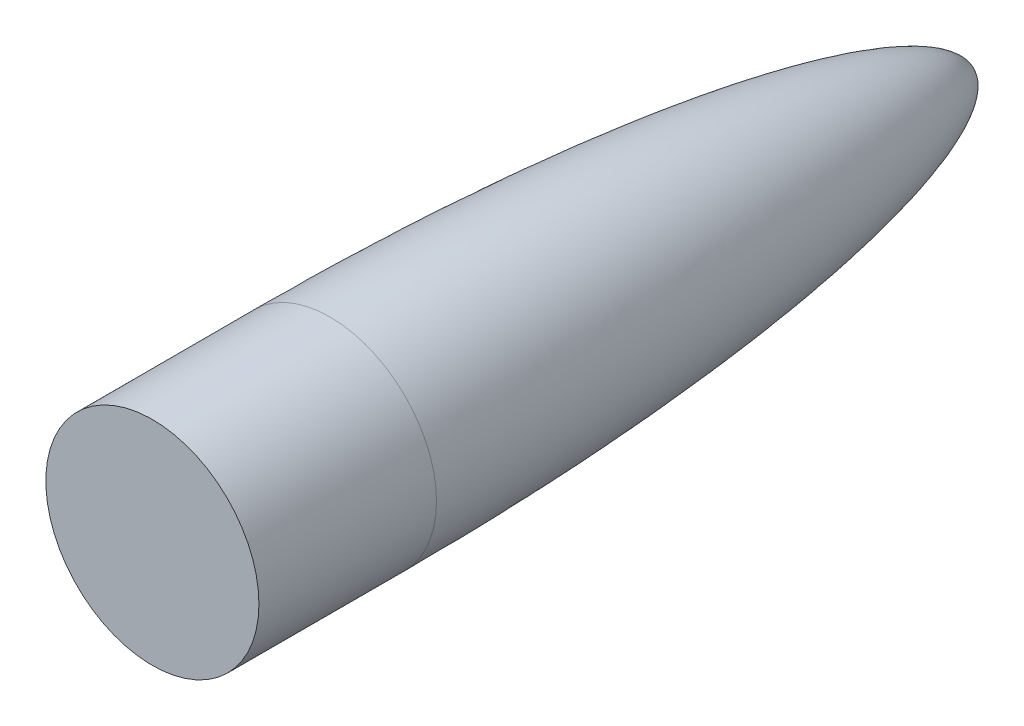
ISO-10303-21;
HEADER;
FILE_DESCRIPTION(('STEP AP214'),'2;1');
FILE_NAME('part.step','',(''),(''),'','','');
FILE_SCHEMA(('AUTOMOTIVE_DESIGN { 1 0 10303 214 1 1 1 1 }'));
ENDSEC;
DATA;
#1=APPLICATION_CONTEXT('core data for automotive mechanical design processes');
#2=APPLICATION_PROTOCOL_DEFINITION('international standard','automotive_design',2000,#1);
#3=PRODUCT_CONTEXT('',#1,'mechanical');
#4=PRODUCT('Part','Part','',(#3));
#5=PRODUCT_RELATED_PRODUCT_CATEGORY('part','',(#4));
#6=PRODUCT_DEFINITION_FORMATION('','',#4);
#7=PRODUCT_DEFINITION_CONTEXT('part definition',#1,'design');
#8=PRODUCT_DEFINITION('design','',#6,#7);
#9=PRODUCT_DEFINITION_SHAPE('','',#8);
#10=(LENGTH_UNIT() NAMED_UNIT(*) SI_UNIT(.MILLI.,.METRE.));
#11=(NAMED_UNIT(*) PLANE_ANGLE_UNIT() SI_UNIT($,.RADIAN.));
#12=(NAMED_UNIT(*) SI_UNIT($,.STERADIAN.) SOLID_ANGLE_UNIT());
#13=UNCERTAINTY_MEASURE_WITH_UNIT(LENGTH_MEASURE(1.E-05),#10,'distance_accuracy_value','');
#14=(GEOMETRIC_REPRESENTATION_CONTEXT(3) GLOBAL_UNCERTAINTY_ASSIGNED_CONTEXT((#13)) GLOBAL_UNIT_ASSIGNED_CONTEXT((#10,
#11,#12)) REPRESENTATION_CONTEXT('',''));
#15=CARTESIAN_POINT('',(0.,0.,0.));
#16=DIRECTION('',(0.,0.,1.));
#17=DIRECTION('',(1.,0.,0.));
#18=AXIS2_PLACEMENT_3D('',#15,#16,#17);
#19=CARTESIAN_POINT('',(0.,0.,127.));
#20=DIRECTION('',(0.,0.,-1.));
#21=DIRECTION('',(-1.,0.,0.));
#22=AXIS2_PLACEMENT_3D('',#19,#20,#21);
#23=CYLINDRICAL_SURFACE('',#22,76.2);
#24=CARTESIAN_POINT('',(0.,0.,127.));
#25=DIRECTION('',(0.,0.,1.));
#26=DIRECTION('',(1.,0.,0.));
#27=AXIS2_PLACEMENT_3D('',#24,#25,#26);
#28=CIRCLE('',#27,76.2);
#29=CARTESIAN_POINT('',(76.2,0.,127.));
#30=VERTEX_POINT('',#29);
#31=EDGE_CURVE('E11',#30,#30,#28,.T.);
#32=ORIENTED_EDGE('',*,*,#31,.F.);
#33=EDGE_LOOP('',(#32));
#34=FACE_BOUND('',#33,.T.);
#35=CARTESIAN_POINT('',(0.,0.,0.));
#36=DIRECTION('',(0.,0.,1.));
#37=DIRECTION('',(1.,0.,0.));
#38=AXIS2_PLACEMENT_3D('',#35,#36,#37);
#39=CIRCLE('',#38,76.2);
#40=CARTESIAN_POINT('',(76.2,0.,0.));
#41=VERTEX_POINT('',#40);
#42=EDGE_CURVE('E54',#41,#41,#39,.T.);
#43=ORIENTED_EDGE('',*,*,#42,.T.);
#44=EDGE_LOOP('',(#43));
#45=FACE_BOUND('',#44,.T.);
#46=ADVANCED_FACE('F43',(#34,#45),#23,.T.);
#47=CARTESIAN_POINT('',(0.,0.,127.));
#48=DIRECTION('',(0.,0.,1.));
#49=DIRECTION('',(1.,0.,0.));
#50=AXIS2_PLACEMENT_3D('',#47,#48,#49);
#51=PLANE('',#50);
#52=ORIENTED_EDGE('',*,*,#31,.T.);
#53=EDGE_LOOP('',(#52));
#54=FACE_BOUND('',#53,.T.);
#55=ADVANCED_FACE('F59',(#54),#51,.T.);
#56=CARTESIAN_POINT('',(0.,0.,-457.20000000036));
#57=CARTESIAN_POINT('',(0.,0.534505425826204,-457.199999783027));
#58=CARTESIAN_POINT('',(0.,1.42373238134091,-457.150080641547));
#59=CARTESIAN_POINT('',(0.,2.71521923637677,-456.955614881372));
#60=CARTESIAN_POINT('',(0.,4.4129638087914,-456.47260424758));
#61=CARTESIAN_POINT('',(0.,6.06046271653739,-455.800493322826));
#62=CARTESIAN_POINT('',(0.,7.9044388777587,-454.795004943715));
#63=CARTESIAN_POINT('',(0.,9.93908196723226,-453.370933283402));
#64=CARTESIAN_POINT('',(0.,12.2396075194511,-451.362493850984));
#65=CARTESIAN_POINT('',(0.,14.9275067360262,-448.481131890771));
#66=CARTESIAN_POINT('',(0.,18.1347136218381,-444.276883573398));
#67=CARTESIAN_POINT('',(0.,22.0574497401589,-437.961024740608));
#68=CARTESIAN_POINT('',(0.,26.8878539745448,-428.331965642796));
#69=CARTESIAN_POINT('',(0.,32.9593931991319,-413.166178505043));
#70=CARTESIAN_POINT('',(0.,39.8262165836885,-391.16484797936));
#71=CARTESIAN_POINT('',(0.,46.6366242791751,-363.148103265867));
#72=CARTESIAN_POINT('',(0.,52.08429790659,-334.84196883935));
#73=CARTESIAN_POINT('',(0.,56.2601064366329,-308.986583678613));
#74=CARTESIAN_POINT('',(0.,59.3136054356389,-287.376938666396));
#75=CARTESIAN_POINT('',(0.,61.529567186895,-270.058940881115));
#76=CARTESIAN_POINT('',(0.,63.5406140090686,-252.715935845925));
#77=CARTESIAN_POINT('',(0.,65.3647843318999,-235.352399190773));
#78=CARTESIAN_POINT('',(0.,67.0163771063259,-217.971608603075));
#79=CARTESIAN_POINT('',(0.,68.5073135504202,-200.576347756858));
#80=CARTESIAN_POINT('',(0.,69.8473256228097,-183.168839163237));
#81=CARTESIAN_POINT('',(0.,71.0445829697644,-165.750929012654));
#82=CARTESIAN_POINT('',(0.,71.9731931533787,-150.502604003337));
#83=CARTESIAN_POINT('',(0.,72.6877041595647,-137.42788786144));
#84=CARTESIAN_POINT('',(0.,73.2303042555184,-126.529690709381));
#85=CARTESIAN_POINT('',(0.,73.6332307411631,-117.809424576478));
#86=CARTESIAN_POINT('',(0.,74.0985534776012,-106.907850963105));
#87=CARTESIAN_POINT('',(0.,74.5964925216243,-93.8226418273542));
#88=CARTESIAN_POINT('',(0.,75.0910094922741,-78.5549922327913));
#89=CARTESIAN_POINT('',(0.,75.4840660879397,-63.2820804128631));
#90=CARTESIAN_POINT('',(0.,75.7497354297913,-50.1926820544756));
#91=CARTESIAN_POINT('',(0.,75.9066526777867,-40.3701170237372));
#92=CARTESIAN_POINT('',(0.,75.9937181520794,-33.8295867266813));
#93=CARTESIAN_POINT('',(0.,76.0546124076784,-28.36285029086));
#94=CARTESIAN_POINT('',(0.,76.096344577244,-24.0209759017673));
#95=CARTESIAN_POINT('',(0.,76.1311045577172,-19.6130894990075));
#96=CARTESIAN_POINT('',(0.,76.1589015464869,-15.3250603335263));
#97=CARTESIAN_POINT('',(0.,76.1797428784855,-10.8242807370204));
#98=CARTESIAN_POINT('',(0.,76.1936340507851,-6.72201940317497));
#99=CARTESIAN_POINT('',(0.,76.1988425547278,-3.01641859044547));
#100=CARTESIAN_POINT('',(0.,76.2000000000003,-0.995244189261283));
#101=CARTESIAN_POINT('',(0.,76.1999999999999,3.60062129747767E-10));
#102=B_SPLINE_CURVE_WITH_KNOTS('',4,(#56,#57,#58,#59,#60,#61,#62,#63,#64,#65,#66,#67,#68,#69,
#70,#71,#72,#73,#74,#75,#76,#77,#78,#79,#80,#81,#82,#83,#84,#85,#86,#87,#88,#89,#90,#91,#92,#93,
#94,#95,#96,#97,#98,#99,#100,#101),.UNSPECIFIED.,.F.,.F.,(5,1,1,1,1,1,1,1,1,1,1,1,1,1,1,1,1,1,1,
1,1,1,1,1,1,1,1,1,1,1,1,1,1,1,1,1,1,1,1,1,1,1,5),(0.0879155684168332,0.0920262599332427,
0.0947550636892094,0.0979296520249649,0.101464838756749,0.105683433455944,0.110876163072534,
0.116992387980646,0.124911267931314,0.135941903085037,0.151483869343221,0.17409533273689,
0.207665509664601,0.261455620271705,0.32859600017871,0.395736396353935,0.429306598054865,
0.462876799755795,0.496446998629301,0.530017197502807,0.563587397258234,0.597157597013661,
0.63072779723917,0.664297997464679,0.697868197835398,0.731438398206117,0.748223498368376,
0.765008598530634,0.781793698692893,0.798578798855152,0.832148999058347,0.865719199261542,
0.899289399410718,0.916074499485305,0.932859599559893,0.941252149614906,0.94964469966992,
0.958037249724933,0.966429799779947,0.97482234983496,0.983214899889973,0.991607449944987,1.),.UNSPECIFIED.);
#103=CARTESIAN_POINT('',(0.,0.,-480.060000000396));
#104=DIRECTION('',(0.,0.,-1.));
#105=AXIS1_PLACEMENT('',#103,#104);
#106=SURFACE_OF_REVOLUTION('',#102,#105);
#107=ORIENTED_EDGE('',*,*,#42,.F.);
#108=EDGE_LOOP('',(#107));
#109=FACE_BOUND('',#108,.T.);
#110=CARTESIAN_POINT('',(0.,0.,-457.20000000036));
#111=VERTEX_POINT('',#110);
#112=VERTEX_LOOP('',#111);
#113=FACE_BOUND('',#112,.T.);
#114=ADVANCED_FACE('F45',(#109,#113),#106,.F.);
#115=CLOSED_SHELL('',(#46,#55,#114));
#116=MANIFOLD_SOLID_BREP('B2',#115);
#117=ADVANCED_BREP_SHAPE_REPRESENTATION('',(#18,#116),#14);
#118=SHAPE_DEFINITION_REPRESENTATION(#9,#117);
ENDSEC;
END-ISO-10303-21;
